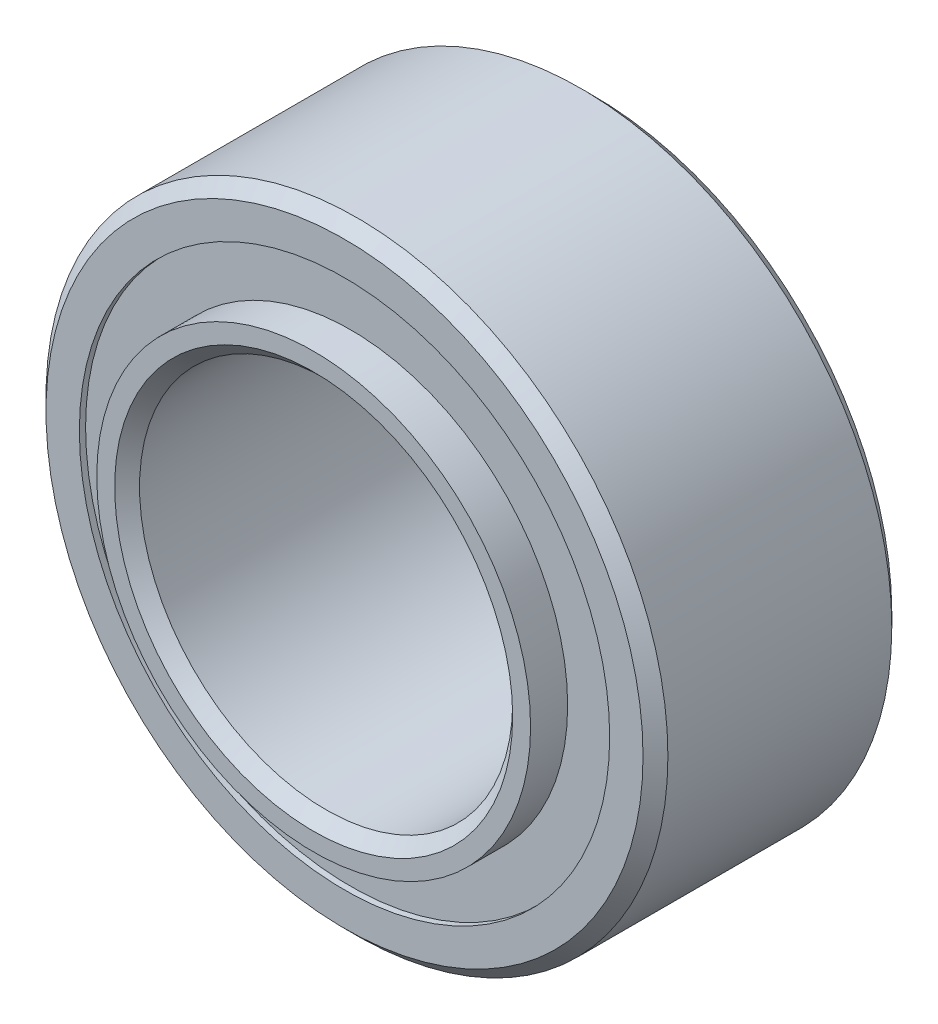
ISO-10303-21;
HEADER;
FILE_DESCRIPTION(('STEP AP214'),'2;1');
FILE_NAME('part.step','',(''),(''),'','','');
FILE_SCHEMA(('AUTOMOTIVE_DESIGN { 1 0 10303 214 1 1 1 1 }'));
ENDSEC;
DATA;
#1=APPLICATION_CONTEXT('core data for automotive mechanical design processes');
#2=APPLICATION_PROTOCOL_DEFINITION('international standard','automotive_design',2000,#1);
#3=PRODUCT_CONTEXT('',#1,'mechanical');
#4=PRODUCT('Part','Part','',(#3));
#5=PRODUCT_RELATED_PRODUCT_CATEGORY('part','',(#4));
#6=PRODUCT_DEFINITION_FORMATION('','',#4);
#7=PRODUCT_DEFINITION_CONTEXT('part definition',#1,'design');
#8=PRODUCT_DEFINITION('design','',#6,#7);
#9=PRODUCT_DEFINITION_SHAPE('','',#8);
#10=(LENGTH_UNIT() NAMED_UNIT(*) SI_UNIT(.MILLI.,.METRE.));
#11=(NAMED_UNIT(*) PLANE_ANGLE_UNIT() SI_UNIT($,.RADIAN.));
#12=(NAMED_UNIT(*) SI_UNIT($,.STERADIAN.) SOLID_ANGLE_UNIT());
#13=UNCERTAINTY_MEASURE_WITH_UNIT(LENGTH_MEASURE(1.E-05),#10,'distance_accuracy_value','');
#14=(GEOMETRIC_REPRESENTATION_CONTEXT(3) GLOBAL_UNCERTAINTY_ASSIGNED_CONTEXT((#13)) GLOBAL_UNIT_ASSIGNED_CONTEXT((#10,
#11,#12)) REPRESENTATION_CONTEXT('',''));
#15=CARTESIAN_POINT('',(0.,0.,0.));
#16=DIRECTION('',(0.,0.,1.));
#17=DIRECTION('',(1.,0.,0.));
#18=AXIS2_PLACEMENT_3D('',#15,#16,#17);
#19=CARTESIAN_POINT('',(0.,3.38434065934066,1.508125));
#20=DIRECTION('',(0.,0.,-1.));
#21=DIRECTION('',(1.,0.,0.));
#22=AXIS2_PLACEMENT_3D('',#19,#20,#21);
#23=PLANE('',#22);
#24=CARTESIAN_POINT('',(0.,0.,1.508125));
#25=DIRECTION('',(0.,0.,1.));
#26=DIRECTION('',(1.,0.,0.));
#27=AXIS2_PLACEMENT_3D('',#24,#25,#26);
#28=CIRCLE('',#27,3.38434065934066);
#29=CARTESIAN_POINT('',(3.38434065934066,0.,1.508125));
#30=VERTEX_POINT('',#29);
#31=EDGE_CURVE('E62',#30,#30,#28,.T.);
#32=ORIENTED_EDGE('',*,*,#31,.T.);
#33=EDGE_LOOP('',(#32));
#34=FACE_BOUND('',#33,.T.);
#35=CARTESIAN_POINT('',(0.,0.,1.508125));
#36=DIRECTION('',(0.,0.,1.));
#37=DIRECTION('',(1.,0.,0.));
#38=AXIS2_PLACEMENT_3D('',#35,#36,#37);
#39=CIRCLE('',#38,2.7686);
#40=CARTESIAN_POINT('',(2.7686,0.,1.508125));
#41=VERTEX_POINT('',#40);
#42=EDGE_CURVE('E11',#41,#41,#39,.T.);
#43=ORIENTED_EDGE('',*,*,#42,.F.);
#44=EDGE_LOOP('',(#43));
#45=FACE_BOUND('',#44,.T.);
#46=ADVANCED_FACE('F48',(#34,#45),#23,.F.);
#47=CARTESIAN_POINT('',(0.,0.,-1.5875));
#48=DIRECTION('',(0.,0.,-1.));
#49=DIRECTION('',(1.,0.,0.));
#50=AXIS2_PLACEMENT_3D('',#47,#48,#49);
#51=CYLINDRICAL_SURFACE('',#50,2.7686);
#52=ORIENTED_EDGE('',*,*,#42,.T.);
#53=EDGE_LOOP('',(#52));
#54=FACE_BOUND('',#53,.T.);
#55=CARTESIAN_POINT('',(0.,0.,0.735956624828183));
#56=DIRECTION('',(0.,0.,1.));
#57=DIRECTION('',(1.,0.,0.));
#58=AXIS2_PLACEMENT_3D('',#55,#56,#57);
#59=CIRCLE('',#58,2.7686);
#60=CARTESIAN_POINT('',(2.7686,0.,0.735956624828183));
#61=VERTEX_POINT('',#60);
#62=EDGE_CURVE('E54',#61,#61,#59,.T.);
#63=ORIENTED_EDGE('',*,*,#62,.F.);
#64=EDGE_LOOP('',(#63));
#65=FACE_BOUND('',#64,.T.);
#66=ADVANCED_FACE('F78',(#54,#65),#51,.F.);
#67=CARTESIAN_POINT('',(0.,3.38434065934066,0.735956624828183));
#68=DIRECTION('',(0.,0.,1.));
#69=DIRECTION('',(-1.,0.,0.));
#70=AXIS2_PLACEMENT_3D('',#67,#68,#69);
#71=PLANE('',#70);
#72=ORIENTED_EDGE('',*,*,#62,.T.);
#73=EDGE_LOOP('',(#72));
#74=FACE_BOUND('',#73,.T.);
#75=CARTESIAN_POINT('',(0.,0.,0.735956624828183));
#76=DIRECTION('',(0.,0.,1.));
#77=DIRECTION('',(1.,0.,0.));
#78=AXIS2_PLACEMENT_3D('',#75,#76,#77);
#79=CIRCLE('',#78,3.38434065934066);
#80=CARTESIAN_POINT('',(3.38434065934066,0.,0.735956624828183));
#81=VERTEX_POINT('',#80);
#82=EDGE_CURVE('E58',#81,#81,#79,.T.);
#83=ORIENTED_EDGE('',*,*,#82,.F.);
#84=EDGE_LOOP('',(#83));
#85=FACE_BOUND('',#84,.T.);
#86=ADVANCED_FACE('F72',(#74,#85),#71,.F.);
#87=CARTESIAN_POINT('',(0.,0.,-1.5875));
#88=DIRECTION('',(0.,0.,-1.));
#89=DIRECTION('',(1.,0.,0.));
#90=AXIS2_PLACEMENT_3D('',#87,#88,#89);
#91=CYLINDRICAL_SURFACE('',#90,3.38434065934066);
#92=ORIENTED_EDGE('',*,*,#82,.T.);
#93=EDGE_LOOP('',(#92));
#94=FACE_BOUND('',#93,.T.);
#95=ORIENTED_EDGE('',*,*,#31,.F.);
#96=EDGE_LOOP('',(#95));
#97=FACE_BOUND('',#96,.T.);
#98=ADVANCED_FACE('F70',(#94,#97),#91,.T.);
#99=CLOSED_SHELL('',(#46,#66,#86,#98));
#100=MANIFOLD_SOLID_BREP('B2',#99);
#101=CARTESIAN_POINT('',(0.,3.38434065934066,-1.508125));
#102=DIRECTION('',(0.,0.,1.));
#103=DIRECTION('',(-1.,0.,0.));
#104=AXIS2_PLACEMENT_3D('',#101,#102,#103);
#105=PLANE('',#104);
#106=CARTESIAN_POINT('',(0.,0.,-1.508125));
#107=DIRECTION('',(0.,0.,1.));
#108=DIRECTION('',(1.,0.,0.));
#109=AXIS2_PLACEMENT_3D('',#106,#107,#108);
#110=CIRCLE('',#109,2.7686);
#111=CARTESIAN_POINT('',(2.7686,0.,-1.508125));
#112=VERTEX_POINT('',#111);
#113=EDGE_CURVE('E47',#112,#112,#110,.T.);
#114=ORIENTED_EDGE('',*,*,#113,.T.);
#115=EDGE_LOOP('',(#114));
#116=FACE_BOUND('',#115,.T.);
#117=CARTESIAN_POINT('',(0.,0.,-1.508125));
#118=DIRECTION('',(0.,0.,1.));
#119=DIRECTION('',(1.,0.,0.));
#120=AXIS2_PLACEMENT_3D('',#117,#118,#119);
#121=CIRCLE('',#120,3.38434065934066);
#122=CARTESIAN_POINT('',(3.38434065934066,0.,-1.508125));
#123=VERTEX_POINT('',#122);
#124=EDGE_CURVE('E130',#123,#123,#121,.T.);
#125=ORIENTED_EDGE('',*,*,#124,.F.);
#126=EDGE_LOOP('',(#125));
#127=FACE_BOUND('',#126,.T.);
#128=ADVANCED_FACE('F116',(#116,#127),#105,.F.);
#129=CARTESIAN_POINT('',(0.,0.,-1.5875));
#130=DIRECTION('',(0.,0.,-1.));
#131=DIRECTION('',(1.,0.,0.));
#132=AXIS2_PLACEMENT_3D('',#129,#130,#131);
#133=CYLINDRICAL_SURFACE('',#132,2.7686);
#134=CARTESIAN_POINT('',(0.,0.,-0.735956624828182));
#135=DIRECTION('',(0.,0.,1.));
#136=DIRECTION('',(1.,0.,0.));
#137=AXIS2_PLACEMENT_3D('',#134,#135,#136);
#138=CIRCLE('',#137,2.7686);
#139=CARTESIAN_POINT('',(2.7686,0.,-0.735956624828182));
#140=VERTEX_POINT('',#139);
#141=EDGE_CURVE('E122',#140,#140,#138,.T.);
#142=ORIENTED_EDGE('',*,*,#141,.T.);
#143=EDGE_LOOP('',(#142));
#144=FACE_BOUND('',#143,.T.);
#145=ORIENTED_EDGE('',*,*,#113,.F.);
#146=EDGE_LOOP('',(#145));
#147=FACE_BOUND('',#146,.T.);
#148=ADVANCED_FACE('F140',(#144,#147),#133,.F.);
#149=CARTESIAN_POINT('',(0.,3.38434065934066,-0.735956624828182));
#150=DIRECTION('',(0.,0.,-1.));
#151=DIRECTION('',(1.,0.,0.));
#152=AXIS2_PLACEMENT_3D('',#149,#150,#151);
#153=PLANE('',#152);
#154=CARTESIAN_POINT('',(0.,0.,-0.735956624828182));
#155=DIRECTION('',(0.,0.,1.));
#156=DIRECTION('',(1.,0.,0.));
#157=AXIS2_PLACEMENT_3D('',#154,#155,#156);
#158=CIRCLE('',#157,3.38434065934066);
#159=CARTESIAN_POINT('',(3.38434065934066,0.,-0.735956624828182));
#160=VERTEX_POINT('',#159);
#161=EDGE_CURVE('E126',#160,#160,#158,.T.);
#162=ORIENTED_EDGE('',*,*,#161,.T.);
#163=EDGE_LOOP('',(#162));
#164=FACE_BOUND('',#163,.T.);
#165=ORIENTED_EDGE('',*,*,#141,.F.);
#166=EDGE_LOOP('',(#165));
#167=FACE_BOUND('',#166,.T.);
#168=ADVANCED_FACE('F144',(#164,#167),#153,.F.);
#169=CARTESIAN_POINT('',(0.,0.,-1.5875));
#170=DIRECTION('',(0.,0.,-1.));
#171=DIRECTION('',(1.,0.,0.));
#172=AXIS2_PLACEMENT_3D('',#169,#170,#171);
#173=CYLINDRICAL_SURFACE('',#172,3.38434065934066);
#174=ORIENTED_EDGE('',*,*,#124,.T.);
#175=EDGE_LOOP('',(#174));
#176=FACE_BOUND('',#175,.T.);
#177=ORIENTED_EDGE('',*,*,#161,.F.);
#178=EDGE_LOOP('',(#177));
#179=FACE_BOUND('',#178,.T.);
#180=ADVANCED_FACE('F136',(#176,#179),#173,.T.);
#181=CLOSED_SHELL('',(#128,#148,#168,#180));
#182=MANIFOLD_SOLID_BREP('B6',#181);
#183=CARTESIAN_POINT('',(-1.86621817602857,2.56862895714048,0.));
#184=DIRECTION('',(0.,0.,-1.));
#185=DIRECTION('',(-0.587785252292462,0.809016994374955,0.));
#186=AXIS2_PLACEMENT_3D('',#183,#184,#185);
#187=SPHERICAL_SURFACE('',#186,0.735956624828183);
#188=CARTESIAN_POINT('',(-1.86621817602857,2.56862895714048,-0.735956624828182));
#189=VERTEX_POINT('',#188);
#190=VERTEX_LOOP('',#189);
#191=FACE_BOUND('',#190,.T.);
#192=ADVANCED_FACE('F184',(#191),#187,.T.);
#193=CLOSED_SHELL('',(#192));
#194=MANIFOLD_SOLID_BREP('B42',#193);
#195=CARTESIAN_POINT('',(-3.0196044392371,0.981128957140492,0.));
#196=DIRECTION('',(0.,0.,-1.));
#197=DIRECTION('',(-0.95105651629515,0.309016994374958,0.));
#198=AXIS2_PLACEMENT_3D('',#195,#196,#197);
#199=SPHERICAL_SURFACE('',#198,0.735956624828183);
#200=CARTESIAN_POINT('',(-3.0196044392371,0.981128957140492,-0.735956624828182));
#201=VERTEX_POINT('',#200);
#202=VERTEX_LOOP('',#201);
#203=FACE_BOUND('',#202,.T.);
#204=ADVANCED_FACE('F205',(#203),#199,.T.);
#205=CLOSED_SHELL('',(#204));
#206=MANIFOLD_SOLID_BREP('B112',#205);
#207=CARTESIAN_POINT('',(-3.01960443923712,-0.981128957140429,0.));
#208=DIRECTION('',(0.,0.,-1.));
#209=DIRECTION('',(-0.951056516295157,-0.309016994374938,0.));
#210=AXIS2_PLACEMENT_3D('',#207,#208,#209);
#211=SPHERICAL_SURFACE('',#210,0.735956624828183);
#212=CARTESIAN_POINT('',(-3.01960443923712,-0.981128957140429,-0.735956624828182));
#213=VERTEX_POINT('',#212);
#214=VERTEX_LOOP('',#213);
#215=FACE_BOUND('',#214,.T.);
#216=ADVANCED_FACE('F226',(#215),#211,.T.);
#217=CLOSED_SHELL('',(#216));
#218=MANIFOLD_SOLID_BREP('B180',#217);
#219=CARTESIAN_POINT('',(-1.86621817602862,-2.56862895714044,0.));
#220=DIRECTION('',(0.,0.,-1.));
#221=DIRECTION('',(-0.58778525229248,-0.809016994374942,0.));
#222=AXIS2_PLACEMENT_3D('',#219,#220,#221);
#223=SPHERICAL_SURFACE('',#222,0.735956624828183);
#224=CARTESIAN_POINT('',(-1.86621817602862,-2.56862895714044,-0.735956624828182));
#225=VERTEX_POINT('',#224);
#226=VERTEX_LOOP('',#225);
#227=FACE_BOUND('',#226,.T.);
#228=ADVANCED_FACE('F247',(#227),#223,.T.);
#229=CLOSED_SHELL('',(#228));
#230=MANIFOLD_SOLID_BREP('B201',#229);
#231=CARTESIAN_POINT('',(0.,-3.175,0.));
#232=DIRECTION('',(0.,0.,-1.));
#233=DIRECTION('',(0.,-1.,0.));
#234=AXIS2_PLACEMENT_3D('',#231,#232,#233);
#235=SPHERICAL_SURFACE('',#234,0.735956624828183);
#236=CARTESIAN_POINT('',(0.,-3.175,-0.735956624828182));
#237=VERTEX_POINT('',#236);
#238=VERTEX_LOOP('',#237);
#239=FACE_BOUND('',#238,.T.);
#240=ADVANCED_FACE('F268',(#239),#235,.T.);
#241=CLOSED_SHELL('',(#240));
#242=MANIFOLD_SOLID_BREP('B222',#241);
#243=CARTESIAN_POINT('',(1.86621817602859,-2.56862895714047,0.));
#244=DIRECTION('',(0.,0.,-1.));
#245=DIRECTION('',(0.587785252292469,-0.809016994374951,0.));
#246=AXIS2_PLACEMENT_3D('',#243,#244,#245);
#247=SPHERICAL_SURFACE('',#246,0.735956624828183);
#248=CARTESIAN_POINT('',(1.86621817602859,-2.56862895714047,-0.735956624828182));
#249=VERTEX_POINT('',#248);
#250=VERTEX_LOOP('',#249);
#251=FACE_BOUND('',#250,.T.);
#252=ADVANCED_FACE('F289',(#251),#247,.T.);
#253=CLOSED_SHELL('',(#252));
#254=MANIFOLD_SOLID_BREP('B243',#253);
#255=CARTESIAN_POINT('',(3.01960443923711,-0.981128957140471,0.));
#256=DIRECTION('',(0.,0.,-1.));
#257=DIRECTION('',(0.951056516295152,-0.309016994374952,0.));
#258=AXIS2_PLACEMENT_3D('',#255,#256,#257);
#259=SPHERICAL_SURFACE('',#258,0.735956624828183);
#260=CARTESIAN_POINT('',(3.01960443923711,-0.981128957140471,-0.735956624828182));
#261=VERTEX_POINT('',#260);
#262=VERTEX_LOOP('',#261);
#263=FACE_BOUND('',#262,.T.);
#264=ADVANCED_FACE('F310',(#263),#259,.T.);
#265=CLOSED_SHELL('',(#264));
#266=MANIFOLD_SOLID_BREP('B264',#265);
#267=CARTESIAN_POINT('',(3.01960443923712,0.98112895714045,0.));
#268=DIRECTION('',(0.,0.,-1.));
#269=DIRECTION('',(0.951056516295155,0.309016994374945,0.));
#270=AXIS2_PLACEMENT_3D('',#267,#268,#269);
#271=SPHERICAL_SURFACE('',#270,0.735956624828183);
#272=CARTESIAN_POINT('',(3.01960443923712,0.98112895714045,-0.735956624828182));
#273=VERTEX_POINT('',#272);
#274=VERTEX_LOOP('',#273);
#275=FACE_BOUND('',#274,.T.);
#276=ADVANCED_FACE('F331',(#275),#271,.T.);
#277=CLOSED_SHELL('',(#276));
#278=MANIFOLD_SOLID_BREP('B285',#277);
#279=CARTESIAN_POINT('',(1.86621817602861,2.56862895714046,0.));
#280=DIRECTION('',(0.,0.,-1.));
#281=DIRECTION('',(0.587785252292474,0.809016994374947,0.));
#282=AXIS2_PLACEMENT_3D('',#279,#280,#281);
#283=SPHERICAL_SURFACE('',#282,0.735956624828183);
#284=CARTESIAN_POINT('',(1.86621817602861,2.56862895714046,-0.735956624828182));
#285=VERTEX_POINT('',#284);
#286=VERTEX_LOOP('',#285);
#287=FACE_BOUND('',#286,.T.);
#288=ADVANCED_FACE('F352',(#287),#283,.T.);
#289=CLOSED_SHELL('',(#288));
#290=MANIFOLD_SOLID_BREP('B306',#289);
#291=CARTESIAN_POINT('',(0.,3.175,0.));
#292=DIRECTION('',(0.,0.,-1.));
#293=DIRECTION('',(0.,1.,0.));
#294=AXIS2_PLACEMENT_3D('',#291,#292,#293);
#295=SPHERICAL_SURFACE('',#294,0.735956624828183);
#296=CARTESIAN_POINT('',(0.,3.175,-0.735956624828182));
#297=VERTEX_POINT('',#296);
#298=VERTEX_LOOP('',#297);
#299=FACE_BOUND('',#298,.T.);
#300=ADVANCED_FACE('F375',(#299),#295,.T.);
#301=CLOSED_SHELL('',(#300));
#302=MANIFOLD_SOLID_BREP('B327',#301);
#303=CARTESIAN_POINT('',(0.,0.,-1.9812));
#304=DIRECTION('',(0.,0.,-1.));
#305=DIRECTION('',(1.,0.,0.));
#306=AXIS2_PLACEMENT_3D('',#303,#304,#305);
#307=CONICAL_SURFACE('',#306,2.54,0.785398163397436);
#308=CARTESIAN_POINT('',(0.,0.,-1.82245));
#309=DIRECTION('',(0.,0.,1.));
#310=DIRECTION('',(1.,0.,0.));
#311=AXIS2_PLACEMENT_3D('',#308,#309,#310);
#312=CIRCLE('',#311,2.38125);
#313=CARTESIAN_POINT('',(2.38125,0.,-1.82245));
#314=VERTEX_POINT('',#313);
#315=EDGE_CURVE('E374',#314,#314,#312,.T.);
#316=ORIENTED_EDGE('',*,*,#315,.T.);
#317=EDGE_LOOP('',(#316));
#318=FACE_BOUND('',#317,.T.);
#319=CARTESIAN_POINT('',(0.,0.,-1.9812));
#320=DIRECTION('',(0.,0.,1.));
#321=DIRECTION('',(1.,0.,0.));
#322=AXIS2_PLACEMENT_3D('',#319,#320,#321);
#323=CIRCLE('',#322,2.54);
#324=CARTESIAN_POINT('',(2.54,0.,-1.9812));
#325=VERTEX_POINT('',#324);
#326=EDGE_CURVE('E417',#325,#325,#323,.T.);
#327=ORIENTED_EDGE('',*,*,#326,.F.);
#328=EDGE_LOOP('',(#327));
#329=FACE_BOUND('',#328,.T.);
#330=ADVANCED_FACE('F395',(#318,#329),#307,.F.);
#331=CARTESIAN_POINT('',(0.,0.,-1.5875));
#332=DIRECTION('',(0.,0.,-1.));
#333=DIRECTION('',(1.,0.,0.));
#334=AXIS2_PLACEMENT_3D('',#331,#332,#333);
#335=CYLINDRICAL_SURFACE('',#334,2.38125);
#336=CARTESIAN_POINT('',(0.,0.,1.82245));
#337=DIRECTION('',(0.,0.,1.));
#338=DIRECTION('',(1.,0.,0.));
#339=AXIS2_PLACEMENT_3D('',#336,#337,#338);
#340=CIRCLE('',#339,2.38125);
#341=CARTESIAN_POINT('',(2.38125,0.,1.82245));
#342=VERTEX_POINT('',#341);
#343=EDGE_CURVE('E401',#342,#342,#340,.T.);
#344=ORIENTED_EDGE('',*,*,#343,.T.);
#345=EDGE_LOOP('',(#344));
#346=FACE_BOUND('',#345,.T.);
#347=ORIENTED_EDGE('',*,*,#315,.F.);
#348=EDGE_LOOP('',(#347));
#349=FACE_BOUND('',#348,.T.);
#350=ADVANCED_FACE('F425',(#346,#349),#335,.F.);
#351=CARTESIAN_POINT('',(0.,0.,1.82245));
#352=DIRECTION('',(0.,0.,1.));
#353=DIRECTION('',(-1.,0.,0.));
#354=AXIS2_PLACEMENT_3D('',#351,#352,#353);
#355=CONICAL_SURFACE('',#354,2.38125,0.785398163397447);
#356=CARTESIAN_POINT('',(0.,0.,1.9812));
#357=DIRECTION('',(0.,0.,1.));
#358=DIRECTION('',(1.,0.,0.));
#359=AXIS2_PLACEMENT_3D('',#356,#357,#358);
#360=CIRCLE('',#359,2.54);
#361=CARTESIAN_POINT('',(2.54,0.,1.9812));
#362=VERTEX_POINT('',#361);
#363=EDGE_CURVE('E405',#362,#362,#360,.T.);
#364=ORIENTED_EDGE('',*,*,#363,.T.);
#365=EDGE_LOOP('',(#364));
#366=FACE_BOUND('',#365,.T.);
#367=ORIENTED_EDGE('',*,*,#343,.F.);
#368=EDGE_LOOP('',(#367));
#369=FACE_BOUND('',#368,.T.);
#370=ADVANCED_FACE('F429',(#366,#369),#355,.F.);
#371=CARTESIAN_POINT('',(0.,2.7686,1.9812));
#372=DIRECTION('',(0.,0.,-1.));
#373=DIRECTION('',(1.,0.,0.));
#374=AXIS2_PLACEMENT_3D('',#371,#372,#373);
#375=PLANE('',#374);
#376=CARTESIAN_POINT('',(0.,0.,1.9812));
#377=DIRECTION('',(0.,0.,1.));
#378=DIRECTION('',(1.,0.,0.));
#379=AXIS2_PLACEMENT_3D('',#376,#377,#378);
#380=CIRCLE('',#379,2.7686);
#381=CARTESIAN_POINT('',(2.7686,0.,1.9812));
#382=VERTEX_POINT('',#381);
#383=EDGE_CURVE('E409',#382,#382,#380,.T.);
#384=ORIENTED_EDGE('',*,*,#383,.T.);
#385=EDGE_LOOP('',(#384));
#386=FACE_BOUND('',#385,.T.);
#387=ORIENTED_EDGE('',*,*,#363,.F.);
#388=EDGE_LOOP('',(#387));
#389=FACE_BOUND('',#388,.T.);
#390=ADVANCED_FACE('F433',(#386,#389),#375,.F.);
#391=CARTESIAN_POINT('',(0.,0.,-1.5875));
#392=DIRECTION('',(0.,0.,-1.));
#393=DIRECTION('',(1.,0.,0.));
#394=AXIS2_PLACEMENT_3D('',#391,#392,#393);
#395=CYLINDRICAL_SURFACE('',#394,2.7686);
#396=CARTESIAN_POINT('',(0.,0.,-1.9812));
#397=DIRECTION('',(0.,0.,1.));
#398=DIRECTION('',(1.,0.,0.));
#399=AXIS2_PLACEMENT_3D('',#396,#397,#398);
#400=CIRCLE('',#399,2.7686);
#401=CARTESIAN_POINT('',(2.7686,0.,-1.9812));
#402=VERTEX_POINT('',#401);
#403=EDGE_CURVE('E414',#402,#402,#400,.T.);
#404=ORIENTED_EDGE('',*,*,#403,.T.);
#405=EDGE_LOOP('',(#404));
#406=FACE_BOUND('',#405,.T.);
#407=ORIENTED_EDGE('',*,*,#383,.F.);
#408=EDGE_LOOP('',(#407));
#409=FACE_BOUND('',#408,.T.);
#410=ADVANCED_FACE('F440',(#406,#409),#395,.T.);
#411=CARTESIAN_POINT('',(0.,2.54,-1.9812));
#412=DIRECTION('',(0.,0.,1.));
#413=DIRECTION('',(-1.,0.,0.));
#414=AXIS2_PLACEMENT_3D('',#411,#412,#413);
#415=PLANE('',#414);
#416=ORIENTED_EDGE('',*,*,#326,.T.);
#417=EDGE_LOOP('',(#416));
#418=FACE_BOUND('',#417,.T.);
#419=ORIENTED_EDGE('',*,*,#403,.F.);
#420=EDGE_LOOP('',(#419));
#421=FACE_BOUND('',#420,.T.);
#422=ADVANCED_FACE('F421',(#418,#421),#415,.F.);
#423=CLOSED_SHELL('',(#330,#350,#370,#390,#410,#422));
#424=MANIFOLD_SOLID_BREP('B348',#423);
#425=CARTESIAN_POINT('',(0.,0.,-1.42875));
#426=DIRECTION('',(0.,0.,1.));
#427=DIRECTION('',(-1.,0.,0.));
#428=AXIS2_PLACEMENT_3D('',#425,#426,#427);
#429=CONICAL_SURFACE('',#428,3.96875,0.785398163397445);
#430=CARTESIAN_POINT('',(0.,0.,-1.5875));
#431=DIRECTION('',(0.,0.,1.));
#432=DIRECTION('',(1.,0.,0.));
#433=AXIS2_PLACEMENT_3D('',#430,#431,#432);
#434=CIRCLE('',#433,3.81);
#435=CARTESIAN_POINT('',(3.81,0.,-1.5875));
#436=VERTEX_POINT('',#435);
#437=EDGE_CURVE('E515',#436,#436,#434,.T.);
#438=ORIENTED_EDGE('',*,*,#437,.T.);
#439=EDGE_LOOP('',(#438));
#440=FACE_BOUND('',#439,.T.);
#441=CARTESIAN_POINT('',(0.,0.,-1.42875));
#442=DIRECTION('',(0.,0.,1.));
#443=DIRECTION('',(1.,0.,0.));
#444=AXIS2_PLACEMENT_3D('',#441,#442,#443);
#445=CIRCLE('',#444,3.96875);
#446=CARTESIAN_POINT('',(3.96875,0.,-1.42875));
#447=VERTEX_POINT('',#446);
#448=EDGE_CURVE('E394',#447,#447,#445,.T.);
#449=ORIENTED_EDGE('',*,*,#448,.F.);
#450=EDGE_LOOP('',(#449));
#451=FACE_BOUND('',#450,.T.);
#452=ADVANCED_FACE('F487',(#440,#451),#429,.T.);
#453=CARTESIAN_POINT('',(0.,0.,-1.5875));
#454=DIRECTION('',(0.,0.,-1.));
#455=DIRECTION('',(1.,0.,0.));
#456=AXIS2_PLACEMENT_3D('',#453,#454,#455);
#457=CYLINDRICAL_SURFACE('',#456,3.96875);
#458=ORIENTED_EDGE('',*,*,#448,.T.);
#459=EDGE_LOOP('',(#458));
#460=FACE_BOUND('',#459,.T.);
#461=CARTESIAN_POINT('',(0.,0.,1.42875));
#462=DIRECTION('',(0.,0.,1.));
#463=DIRECTION('',(1.,0.,0.));
#464=AXIS2_PLACEMENT_3D('',#461,#462,#463);
#465=CIRCLE('',#464,3.96875);
#466=CARTESIAN_POINT('',(3.96875,0.,1.42875));
#467=VERTEX_POINT('',#466);
#468=EDGE_CURVE('E493',#467,#467,#465,.T.);
#469=ORIENTED_EDGE('',*,*,#468,.F.);
#470=EDGE_LOOP('',(#469));
#471=FACE_BOUND('',#470,.T.);
#472=ADVANCED_FACE('F533',(#460,#471),#457,.T.);
#473=CARTESIAN_POINT('',(0.,0.,1.5875));
#474=DIRECTION('',(0.,0.,-1.));
#475=DIRECTION('',(1.,0.,0.));
#476=AXIS2_PLACEMENT_3D('',#473,#474,#475);
#477=CONICAL_SURFACE('',#476,3.81,0.785398163397444);
#478=ORIENTED_EDGE('',*,*,#468,.T.);
#479=EDGE_LOOP('',(#478));
#480=FACE_BOUND('',#479,.T.);
#481=CARTESIAN_POINT('',(0.,0.,1.5875));
#482=DIRECTION('',(0.,0.,1.));
#483=DIRECTION('',(1.,0.,0.));
#484=AXIS2_PLACEMENT_3D('',#481,#482,#483);
#485=CIRCLE('',#484,3.81);
#486=CARTESIAN_POINT('',(3.81,0.,1.5875));
#487=VERTEX_POINT('',#486);
#488=EDGE_CURVE('E497',#487,#487,#485,.T.);
#489=ORIENTED_EDGE('',*,*,#488,.F.);
#490=EDGE_LOOP('',(#489));
#491=FACE_BOUND('',#490,.T.);
#492=ADVANCED_FACE('F537',(#480,#491),#477,.T.);
#493=CARTESIAN_POINT('',(0.,3.81,1.5875));
#494=DIRECTION('',(0.,0.,-1.));
#495=DIRECTION('',(1.,0.,0.));
#496=AXIS2_PLACEMENT_3D('',#493,#494,#495);
#497=PLANE('',#496);
#498=ORIENTED_EDGE('',*,*,#488,.T.);
#499=EDGE_LOOP('',(#498));
#500=FACE_BOUND('',#499,.T.);
#501=CARTESIAN_POINT('',(0.,0.,1.5875));
#502=DIRECTION('',(0.,0.,1.));
#503=DIRECTION('',(1.,0.,0.));
#504=AXIS2_PLACEMENT_3D('',#501,#502,#503);
#505=CIRCLE('',#504,3.38434065934066);
#506=CARTESIAN_POINT('',(3.38434065934066,0.,1.5875));
#507=VERTEX_POINT('',#506);
#508=EDGE_CURVE('E501',#507,#507,#505,.T.);
#509=ORIENTED_EDGE('',*,*,#508,.F.);
#510=EDGE_LOOP('',(#509));
#511=FACE_BOUND('',#510,.T.);
#512=ADVANCED_FACE('F541',(#500,#511),#497,.F.);
#513=CARTESIAN_POINT('',(0.,0.,-1.5875));
#514=DIRECTION('',(0.,0.,-1.));
#515=DIRECTION('',(1.,0.,0.));
#516=AXIS2_PLACEMENT_3D('',#513,#514,#515);
#517=CYLINDRICAL_SURFACE('',#516,3.38434065934066);
#518=ORIENTED_EDGE('',*,*,#508,.T.);
#519=EDGE_LOOP('',(#518));
#520=FACE_BOUND('',#519,.T.);
#521=CARTESIAN_POINT('',(0.,0.,0.705555555555556));
#522=DIRECTION('',(0.,0.,1.));
#523=DIRECTION('',(1.,0.,0.));
#524=AXIS2_PLACEMENT_3D('',#521,#522,#523);
#525=CIRCLE('',#524,3.38434065934066);
#526=CARTESIAN_POINT('',(3.38434065934066,0.,0.705555555555556));
#527=VERTEX_POINT('',#526);
#528=EDGE_CURVE('E506',#527,#527,#525,.T.);
#529=ORIENTED_EDGE('',*,*,#528,.F.);
#530=EDGE_LOOP('',(#529));
#531=FACE_BOUND('',#530,.T.);
#532=ADVANCED_FACE('F547',(#520,#531),#517,.F.);
#533=CARTESIAN_POINT('',(0.,0.,0.));
#534=DIRECTION('',(0.,0.,-1.));
#535=DIRECTION('',(1.,0.,0.));
#536=AXIS2_PLACEMENT_3D('',#533,#534,#535);
#537=TOROIDAL_SURFACE('',#536,3.175,0.735956624828183);
#538=ORIENTED_EDGE('',*,*,#528,.T.);
#539=EDGE_LOOP('',(#538));
#540=FACE_BOUND('',#539,.T.);
#541=CARTESIAN_POINT('',(0.,0.,-0.705555555555555));
#542=DIRECTION('',(0.,0.,1.));
#543=DIRECTION('',(1.,0.,0.));
#544=AXIS2_PLACEMENT_3D('',#541,#542,#543);
#545=CIRCLE('',#544,3.38434065934066);
#546=CARTESIAN_POINT('',(3.38434065934066,0.,-0.705555555555555));
#547=VERTEX_POINT('',#546);
#548=EDGE_CURVE('E509',#547,#547,#545,.T.);
#549=ORIENTED_EDGE('',*,*,#548,.F.);
#550=EDGE_LOOP('',(#549));
#551=FACE_BOUND('',#550,.T.);
#552=ADVANCED_FACE('F529',(#540,#551),#537,.F.);
#553=CARTESIAN_POINT('',(0.,0.,-1.5875));
#554=DIRECTION('',(0.,0.,-1.));
#555=DIRECTION('',(1.,0.,0.));
#556=AXIS2_PLACEMENT_3D('',#553,#554,#555);
#557=CYLINDRICAL_SURFACE('',#556,3.38434065934066);
#558=ORIENTED_EDGE('',*,*,#548,.T.);
#559=EDGE_LOOP('',(#558));
#560=FACE_BOUND('',#559,.T.);
#561=CARTESIAN_POINT('',(0.,0.,-1.5875));
#562=DIRECTION('',(0.,0.,1.));
#563=DIRECTION('',(1.,0.,0.));
#564=AXIS2_PLACEMENT_3D('',#561,#562,#563);
#565=CIRCLE('',#564,3.38434065934066);
#566=CARTESIAN_POINT('',(3.38434065934066,0.,-1.5875));
#567=VERTEX_POINT('',#566);
#568=EDGE_CURVE('E512',#567,#567,#565,.T.);
#569=ORIENTED_EDGE('',*,*,#568,.F.);
#570=EDGE_LOOP('',(#569));
#571=FACE_BOUND('',#570,.T.);
#572=ADVANCED_FACE('F523',(#560,#571),#557,.F.);
#573=CARTESIAN_POINT('',(0.,3.81,-1.5875));
#574=DIRECTION('',(0.,0.,1.));
#575=DIRECTION('',(-1.,0.,0.));
#576=AXIS2_PLACEMENT_3D('',#573,#574,#575);
#577=PLANE('',#576);
#578=ORIENTED_EDGE('',*,*,#568,.T.);
#579=EDGE_LOOP('',(#578));
#580=FACE_BOUND('',#579,.T.);
#581=ORIENTED_EDGE('',*,*,#437,.F.);
#582=EDGE_LOOP('',(#581));
#583=FACE_BOUND('',#582,.T.);
#584=ADVANCED_FACE('F521',(#580,#583),#577,.F.);
#585=CLOSED_SHELL('',(#452,#472,#492,#512,#532,#552,#572,#584));
#586=MANIFOLD_SOLID_BREP('B369',#585);
#587=ADVANCED_BREP_SHAPE_REPRESENTATION('',(#18,#100,#182,#194,#206,#218,#230,#242,#254,#266,
#278,#290,#302,#424,#586),#14);
#588=SHAPE_DEFINITION_REPRESENTATION(#9,#587);
ENDSEC;
END-ISO-10303-21;
